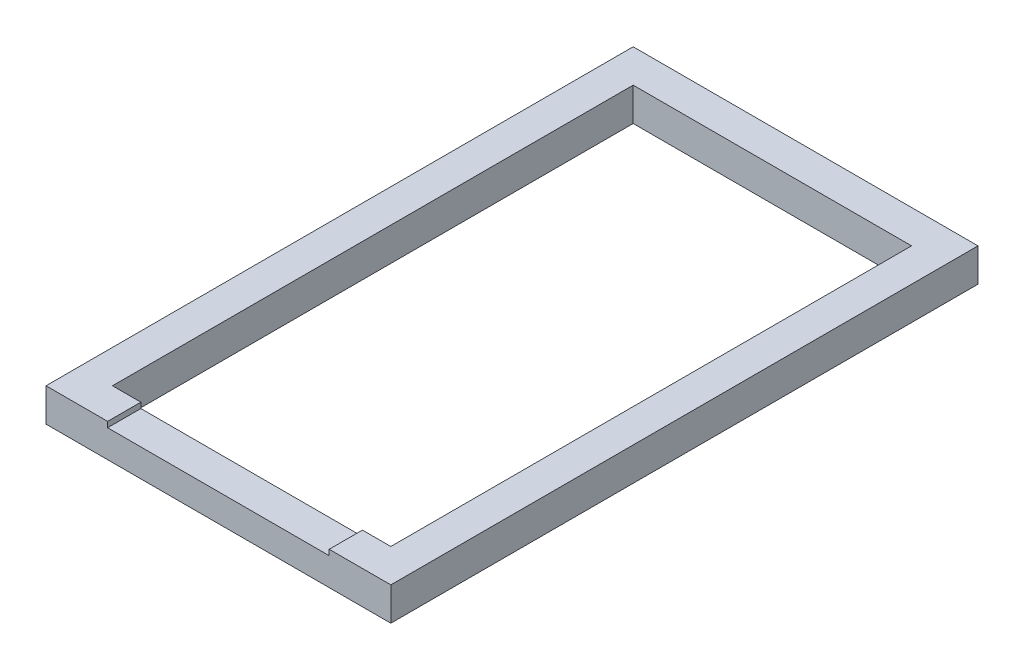
ISO-10303-21;
HEADER;
FILE_DESCRIPTION(('STEP AP214'),'2;1');
FILE_NAME('part.step','',(''),(''),'','','');
FILE_SCHEMA(('AUTOMOTIVE_DESIGN { 1 0 10303 214 1 1 1 1 }'));
ENDSEC;
DATA;
#1=APPLICATION_CONTEXT('core data for automotive mechanical design processes');
#2=APPLICATION_PROTOCOL_DEFINITION('international standard','automotive_design',2000,#1);
#3=PRODUCT_CONTEXT('',#1,'mechanical');
#4=PRODUCT('Part','Part','',(#3));
#5=PRODUCT_RELATED_PRODUCT_CATEGORY('part','',(#4));
#6=PRODUCT_DEFINITION_FORMATION('','',#4);
#7=PRODUCT_DEFINITION_CONTEXT('part definition',#1,'design');
#8=PRODUCT_DEFINITION('design','',#6,#7);
#9=PRODUCT_DEFINITION_SHAPE('','',#8);
#10=(LENGTH_UNIT() NAMED_UNIT(*) SI_UNIT(.MILLI.,.METRE.));
#11=(NAMED_UNIT(*) PLANE_ANGLE_UNIT() SI_UNIT($,.RADIAN.));
#12=(NAMED_UNIT(*) SI_UNIT($,.STERADIAN.) SOLID_ANGLE_UNIT());
#13=UNCERTAINTY_MEASURE_WITH_UNIT(LENGTH_MEASURE(1.E-05),#10,'distance_accuracy_value','');
#14=(GEOMETRIC_REPRESENTATION_CONTEXT(3) GLOBAL_UNCERTAINTY_ASSIGNED_CONTEXT((#13)) GLOBAL_UNIT_ASSIGNED_CONTEXT((#10,
#11,#12)) REPRESENTATION_CONTEXT('',''));
#15=CARTESIAN_POINT('',(0.,0.,0.));
#16=DIRECTION('',(0.,0.,1.));
#17=DIRECTION('',(1.,0.,0.));
#18=AXIS2_PLACEMENT_3D('',#15,#16,#17);
#19=CARTESIAN_POINT('',(-3112.49999999998,-600.,5300.));
#20=DIRECTION('',(0.,0.,1.));
#21=DIRECTION('',(1.,0.,0.));
#22=AXIS2_PLACEMENT_3D('',#19,#20,#21);
#23=PLANE('',#22);
#24=DIRECTION('',(1.,0.,0.));
#25=VECTOR('',#24,1.);
#26=CARTESIAN_POINT('',(-3112.49999999998,0.,5300.));
#27=LINE('',#26,#25);
#28=CARTESIAN_POINT('',(2000.,0.,5300.));
#29=VERTEX_POINT('',#28);
#30=CARTESIAN_POINT('',(3112.5,0.,5300.));
#31=VERTEX_POINT('',#30);
#32=EDGE_CURVE('E237',#29,#31,#27,.T.);
#33=ORIENTED_EDGE('',*,*,#32,.F.);
#34=DIRECTION('',(0.,-1.,0.));
#35=VECTOR('',#34,1.);
#36=CARTESIAN_POINT('',(2000.,-600.,5300.));
#37=LINE('',#36,#35);
#38=CARTESIAN_POINT('',(2000.,-99.9999999999999,5300.));
#39=VERTEX_POINT('',#38);
#40=EDGE_CURVE('E149',#29,#39,#37,.T.);
#41=ORIENTED_EDGE('',*,*,#40,.T.);
#42=DIRECTION('',(-1.,0.,0.));
#43=VECTOR('',#42,1.);
#44=CARTESIAN_POINT('',(-3112.49999999998,-99.9999999999999,5300.));
#45=LINE('',#44,#43);
#46=CARTESIAN_POINT('',(-2000.,-99.9999999999999,5300.));
#47=VERTEX_POINT('',#46);
#48=EDGE_CURVE('E131',#39,#47,#45,.T.);
#49=ORIENTED_EDGE('',*,*,#48,.T.);
#50=DIRECTION('',(0.,1.,0.));
#51=VECTOR('',#50,1.);
#52=CARTESIAN_POINT('',(-2000.,-600.,5300.));
#53=LINE('',#52,#51);
#54=CARTESIAN_POINT('',(-2000.,0.,5300.));
#55=VERTEX_POINT('',#54);
#56=EDGE_CURVE('E142',#47,#55,#53,.T.);
#57=ORIENTED_EDGE('',*,*,#56,.T.);
#58=CARTESIAN_POINT('',(-3112.49999999998,0.,5300.));
#59=VERTEX_POINT('',#58);
#60=EDGE_CURVE('E238',#59,#55,#27,.T.);
#61=ORIENTED_EDGE('',*,*,#60,.F.);
#62=DIRECTION('',(0.,1.,0.));
#63=VECTOR('',#62,1.);
#64=CARTESIAN_POINT('',(-3112.49999999998,-600.,5300.));
#65=LINE('',#64,#63);
#66=CARTESIAN_POINT('',(-3112.49999999998,-600.,5300.));
#67=VERTEX_POINT('',#66);
#68=EDGE_CURVE('E42',#67,#59,#65,.T.);
#69=ORIENTED_EDGE('',*,*,#68,.F.);
#70=DIRECTION('',(1.,0.,0.));
#71=VECTOR('',#70,1.);
#72=CARTESIAN_POINT('',(-3112.49999999998,-600.,5300.));
#73=LINE('',#72,#71);
#74=CARTESIAN_POINT('',(3112.5,-600.,5300.));
#75=VERTEX_POINT('',#74);
#76=EDGE_CURVE('E221',#67,#75,#73,.T.);
#77=ORIENTED_EDGE('',*,*,#76,.T.);
#78=DIRECTION('',(0.,1.,0.));
#79=VECTOR('',#78,1.);
#80=CARTESIAN_POINT('',(3112.5,-600.,5300.));
#81=LINE('',#80,#79);
#82=EDGE_CURVE('E249',#75,#31,#81,.T.);
#83=ORIENTED_EDGE('',*,*,#82,.T.);
#84=EDGE_LOOP('',(#33,#41,#49,#57,#61,#69,#77,#83));
#85=FACE_BOUND('',#84,.T.);
#86=ADVANCED_FACE('F38',(#85),#23,.T.);
#87=CARTESIAN_POINT('',(0.,0.,0.));
#88=DIRECTION('',(0.,1.,0.));
#89=DIRECTION('',(0.,0.,1.));
#90=AXIS2_PLACEMENT_3D('',#87,#88,#89);
#91=PLANE('',#90);
#92=DIRECTION('',(1.,0.,0.));
#93=VECTOR('',#92,1.);
#94=CARTESIAN_POINT('',(-2512.49999999998,0.,4700.));
#95=LINE('',#94,#93);
#96=CARTESIAN_POINT('',(2000.,0.,4700.));
#97=VERTEX_POINT('',#96);
#98=CARTESIAN_POINT('',(2512.5,0.,4700.));
#99=VERTEX_POINT('',#98);
#100=EDGE_CURVE('E195',#97,#99,#95,.T.);
#101=ORIENTED_EDGE('',*,*,#100,.F.);
#102=DIRECTION('',(0.,0.,1.));
#103=VECTOR('',#102,1.);
#104=CARTESIAN_POINT('',(2000.,0.,698.750195251481));
#105=LINE('',#104,#103);
#106=EDGE_CURVE('E162',#97,#29,#105,.T.);
#107=ORIENTED_EDGE('',*,*,#106,.T.);
#108=ORIENTED_EDGE('',*,*,#32,.T.);
#109=DIRECTION('',(0.,0.,-1.));
#110=VECTOR('',#109,1.);
#111=CARTESIAN_POINT('',(3112.5,0.,-5300.));
#112=LINE('',#111,#110);
#113=CARTESIAN_POINT('',(3112.5,0.,-5300.));
#114=VERTEX_POINT('',#113);
#115=EDGE_CURVE('E241',#31,#114,#112,.T.);
#116=ORIENTED_EDGE('',*,*,#115,.T.);
#117=DIRECTION('',(-1.,0.,0.));
#118=VECTOR('',#117,1.);
#119=CARTESIAN_POINT('',(-3112.49999999998,0.,-5300.));
#120=LINE('',#119,#118);
#121=CARTESIAN_POINT('',(-3112.49999999998,0.,-5300.));
#122=VERTEX_POINT('',#121);
#123=EDGE_CURVE('E222',#114,#122,#120,.T.);
#124=ORIENTED_EDGE('',*,*,#123,.T.);
#125=DIRECTION('',(0.,0.,1.));
#126=VECTOR('',#125,1.);
#127=CARTESIAN_POINT('',(-3112.49999999998,0.,-5300.));
#128=LINE('',#127,#126);
#129=EDGE_CURVE('E206',#122,#59,#128,.T.);
#130=ORIENTED_EDGE('',*,*,#129,.T.);
#131=ORIENTED_EDGE('',*,*,#60,.T.);
#132=DIRECTION('',(0.,0.,1.));
#133=VECTOR('',#132,1.);
#134=CARTESIAN_POINT('',(-2000.,0.,698.750195251482));
#135=LINE('',#134,#133);
#136=CARTESIAN_POINT('',(-2000.,0.,4700.));
#137=VERTEX_POINT('',#136);
#138=EDGE_CURVE('E139',#137,#55,#135,.T.);
#139=ORIENTED_EDGE('',*,*,#138,.F.);
#140=CARTESIAN_POINT('',(-2512.49999999998,0.,4700.));
#141=VERTEX_POINT('',#140);
#142=EDGE_CURVE('E196',#141,#137,#95,.T.);
#143=ORIENTED_EDGE('',*,*,#142,.F.);
#144=DIRECTION('',(0.,0.,1.));
#145=VECTOR('',#144,1.);
#146=CARTESIAN_POINT('',(-2512.49999999998,0.,-4700.));
#147=LINE('',#146,#145);
#148=CARTESIAN_POINT('',(-2512.49999999998,0.,-4700.));
#149=VERTEX_POINT('',#148);
#150=EDGE_CURVE('E191',#149,#141,#147,.T.);
#151=ORIENTED_EDGE('',*,*,#150,.F.);
#152=DIRECTION('',(-1.,0.,0.));
#153=VECTOR('',#152,1.);
#154=CARTESIAN_POINT('',(-2512.49999999998,0.,-4700.));
#155=LINE('',#154,#153);
#156=CARTESIAN_POINT('',(2512.5,0.,-4700.));
#157=VERTEX_POINT('',#156);
#158=EDGE_CURVE('E188',#157,#149,#155,.T.);
#159=ORIENTED_EDGE('',*,*,#158,.F.);
#160=DIRECTION('',(0.,0.,-1.));
#161=VECTOR('',#160,1.);
#162=CARTESIAN_POINT('',(2512.5,0.,-4700.));
#163=LINE('',#162,#161);
#164=EDGE_CURVE('E177',#99,#157,#163,.T.);
#165=ORIENTED_EDGE('',*,*,#164,.F.);
#166=EDGE_LOOP('',(#101,#107,#108,#116,#124,#130,#131,#139,#143,#151,#159,#165));
#167=FACE_BOUND('',#166,.T.);
#168=ADVANCED_FACE('F262',(#167),#91,.T.);
#169=CARTESIAN_POINT('',(-2512.49999999998,-600.,4700.));
#170=DIRECTION('',(0.,0.,1.));
#171=DIRECTION('',(1.,0.,0.));
#172=AXIS2_PLACEMENT_3D('',#169,#170,#171);
#173=PLANE('',#172);
#174=DIRECTION('',(0.,1.,0.));
#175=VECTOR('',#174,1.);
#176=CARTESIAN_POINT('',(2000.,-600.,4700.));
#177=LINE('',#176,#175);
#178=CARTESIAN_POINT('',(2000.,-99.9999999999999,4700.));
#179=VERTEX_POINT('',#178);
#180=EDGE_CURVE('E138',#179,#97,#177,.T.);
#181=ORIENTED_EDGE('',*,*,#180,.T.);
#182=ORIENTED_EDGE('',*,*,#100,.T.);
#183=DIRECTION('',(0.,1.,0.));
#184=VECTOR('',#183,1.);
#185=CARTESIAN_POINT('',(2512.5,-600.,4700.));
#186=LINE('',#185,#184);
#187=CARTESIAN_POINT('',(2512.5,-600.,4700.));
#188=VERTEX_POINT('',#187);
#189=EDGE_CURVE('E207',#188,#99,#186,.T.);
#190=ORIENTED_EDGE('',*,*,#189,.F.);
#191=DIRECTION('',(1.,0.,0.));
#192=VECTOR('',#191,1.);
#193=CARTESIAN_POINT('',(-2512.49999999998,-600.,4700.));
#194=LINE('',#193,#192);
#195=CARTESIAN_POINT('',(-2512.49999999998,-600.,4700.));
#196=VERTEX_POINT('',#195);
#197=EDGE_CURVE('E64',#196,#188,#194,.T.);
#198=ORIENTED_EDGE('',*,*,#197,.F.);
#199=DIRECTION('',(0.,1.,0.));
#200=VECTOR('',#199,1.);
#201=CARTESIAN_POINT('',(-2512.49999999998,-600.,4700.));
#202=LINE('',#201,#200);
#203=EDGE_CURVE('E211',#196,#141,#202,.T.);
#204=ORIENTED_EDGE('',*,*,#203,.T.);
#205=ORIENTED_EDGE('',*,*,#142,.T.);
#206=DIRECTION('',(0.,-1.,0.));
#207=VECTOR('',#206,1.);
#208=CARTESIAN_POINT('',(-2000.,-600.,4700.));
#209=LINE('',#208,#207);
#210=CARTESIAN_POINT('',(-2000.,-99.9999999999999,4700.));
#211=VERTEX_POINT('',#210);
#212=EDGE_CURVE('E171',#137,#211,#209,.T.);
#213=ORIENTED_EDGE('',*,*,#212,.T.);
#214=DIRECTION('',(1.,0.,0.));
#215=VECTOR('',#214,1.);
#216=CARTESIAN_POINT('',(-3112.49999999998,-99.9999999999999,4700.));
#217=LINE('',#216,#215);
#218=EDGE_CURVE('E134',#211,#179,#217,.T.);
#219=ORIENTED_EDGE('',*,*,#218,.T.);
#220=EDGE_LOOP('',(#181,#182,#190,#198,#204,#205,#213,#219));
#221=FACE_BOUND('',#220,.T.);
#222=ADVANCED_FACE('F286',(#221),#173,.F.);
#223=CARTESIAN_POINT('',(-3112.49999999998,-600.,-5300.));
#224=DIRECTION('',(-1.,0.,0.));
#225=DIRECTION('',(0.,0.,1.));
#226=AXIS2_PLACEMENT_3D('',#223,#224,#225);
#227=PLANE('',#226);
#228=ORIENTED_EDGE('',*,*,#129,.F.);
#229=DIRECTION('',(0.,1.,0.));
#230=VECTOR('',#229,1.);
#231=CARTESIAN_POINT('',(-3112.49999999998,-600.,-5300.));
#232=LINE('',#231,#230);
#233=CARTESIAN_POINT('',(-3112.49999999998,-600.,-5300.));
#234=VERTEX_POINT('',#233);
#235=EDGE_CURVE('E11',#234,#122,#232,.T.);
#236=ORIENTED_EDGE('',*,*,#235,.F.);
#237=DIRECTION('',(0.,0.,1.));
#238=VECTOR('',#237,1.);
#239=CARTESIAN_POINT('',(-3112.49999999998,-600.,-5300.));
#240=LINE('',#239,#238);
#241=EDGE_CURVE('E217',#234,#67,#240,.T.);
#242=ORIENTED_EDGE('',*,*,#241,.T.);
#243=ORIENTED_EDGE('',*,*,#68,.T.);
#244=EDGE_LOOP('',(#228,#236,#242,#243));
#245=FACE_BOUND('',#244,.T.);
#246=ADVANCED_FACE('F40',(#245),#227,.T.);
#247=CARTESIAN_POINT('',(-3112.49999999998,-600.,-5300.));
#248=DIRECTION('',(0.,0.,-1.));
#249=DIRECTION('',(-1.,0.,0.));
#250=AXIS2_PLACEMENT_3D('',#247,#248,#249);
#251=PLANE('',#250);
#252=ORIENTED_EDGE('',*,*,#123,.F.);
#253=DIRECTION('',(0.,1.,0.));
#254=VECTOR('',#253,1.);
#255=CARTESIAN_POINT('',(3112.5,-600.,-5300.));
#256=LINE('',#255,#254);
#257=CARTESIAN_POINT('',(3112.5,-600.,-5300.));
#258=VERTEX_POINT('',#257);
#259=EDGE_CURVE('E48',#258,#114,#256,.T.);
#260=ORIENTED_EDGE('',*,*,#259,.F.);
#261=DIRECTION('',(-1.,0.,0.));
#262=VECTOR('',#261,1.);
#263=CARTESIAN_POINT('',(-3112.49999999998,-600.,-5300.));
#264=LINE('',#263,#262);
#265=EDGE_CURVE('E230',#258,#234,#264,.T.);
#266=ORIENTED_EDGE('',*,*,#265,.T.);
#267=ORIENTED_EDGE('',*,*,#235,.T.);
#268=EDGE_LOOP('',(#252,#260,#266,#267));
#269=FACE_BOUND('',#268,.T.);
#270=ADVANCED_FACE('F265',(#269),#251,.T.);
#271=CARTESIAN_POINT('',(3112.5,-600.,-5300.));
#272=DIRECTION('',(1.,0.,0.));
#273=DIRECTION('',(0.,0.,-1.));
#274=AXIS2_PLACEMENT_3D('',#271,#272,#273);
#275=PLANE('',#274);
#276=ORIENTED_EDGE('',*,*,#115,.F.);
#277=ORIENTED_EDGE('',*,*,#82,.F.);
#278=DIRECTION('',(0.,0.,-1.));
#279=VECTOR('',#278,1.);
#280=CARTESIAN_POINT('',(3112.5,-600.,-5300.));
#281=LINE('',#280,#279);
#282=EDGE_CURVE('E226',#75,#258,#281,.T.);
#283=ORIENTED_EDGE('',*,*,#282,.T.);
#284=ORIENTED_EDGE('',*,*,#259,.T.);
#285=EDGE_LOOP('',(#276,#277,#283,#284));
#286=FACE_BOUND('',#285,.T.);
#287=ADVANCED_FACE('F271',(#286),#275,.T.);
#288=CARTESIAN_POINT('',(0.,-600.,0.));
#289=DIRECTION('',(0.,1.,0.));
#290=DIRECTION('',(0.,0.,1.));
#291=AXIS2_PLACEMENT_3D('',#288,#289,#290);
#292=PLANE('',#291);
#293=DIRECTION('',(0.,0.,-1.));
#294=VECTOR('',#293,1.);
#295=CARTESIAN_POINT('',(2512.5,-600.,-4700.));
#296=LINE('',#295,#294);
#297=CARTESIAN_POINT('',(2512.5,-600.,-4700.));
#298=VERTEX_POINT('',#297);
#299=EDGE_CURVE('E183',#188,#298,#296,.T.);
#300=ORIENTED_EDGE('',*,*,#299,.T.);
#301=DIRECTION('',(-1.,0.,0.));
#302=VECTOR('',#301,1.);
#303=CARTESIAN_POINT('',(-2512.49999999998,-600.,-4700.));
#304=LINE('',#303,#302);
#305=CARTESIAN_POINT('',(-2512.49999999998,-600.,-4700.));
#306=VERTEX_POINT('',#305);
#307=EDGE_CURVE('E172',#298,#306,#304,.T.);
#308=ORIENTED_EDGE('',*,*,#307,.T.);
#309=DIRECTION('',(0.,0.,1.));
#310=VECTOR('',#309,1.);
#311=CARTESIAN_POINT('',(-2512.49999999998,-600.,-4700.));
#312=LINE('',#311,#310);
#313=EDGE_CURVE('E176',#306,#196,#312,.T.);
#314=ORIENTED_EDGE('',*,*,#313,.T.);
#315=ORIENTED_EDGE('',*,*,#197,.T.);
#316=EDGE_LOOP('',(#300,#308,#314,#315));
#317=FACE_BOUND('',#316,.T.);
#318=ORIENTED_EDGE('',*,*,#241,.F.);
#319=ORIENTED_EDGE('',*,*,#265,.F.);
#320=ORIENTED_EDGE('',*,*,#282,.F.);
#321=ORIENTED_EDGE('',*,*,#76,.F.);
#322=EDGE_LOOP('',(#318,#319,#320,#321));
#323=FACE_BOUND('',#322,.T.);
#324=ADVANCED_FACE('F268',(#317,#323),#292,.F.);
#325=CARTESIAN_POINT('',(-2512.49999999998,-600.,-4700.));
#326=DIRECTION('',(0.,0.,-1.));
#327=DIRECTION('',(-1.,0.,0.));
#328=AXIS2_PLACEMENT_3D('',#325,#326,#327);
#329=PLANE('',#328);
#330=ORIENTED_EDGE('',*,*,#158,.T.);
#331=DIRECTION('',(0.,1.,0.));
#332=VECTOR('',#331,1.);
#333=CARTESIAN_POINT('',(-2512.49999999998,-600.,-4700.));
#334=LINE('',#333,#332);
#335=EDGE_CURVE('E187',#306,#149,#334,.T.);
#336=ORIENTED_EDGE('',*,*,#335,.F.);
#337=ORIENTED_EDGE('',*,*,#307,.F.);
#338=DIRECTION('',(0.,1.,0.));
#339=VECTOR('',#338,1.);
#340=CARTESIAN_POINT('',(2512.5,-600.,-4700.));
#341=LINE('',#340,#339);
#342=EDGE_CURVE('E203',#298,#157,#341,.T.);
#343=ORIENTED_EDGE('',*,*,#342,.T.);
#344=EDGE_LOOP('',(#330,#336,#337,#343));
#345=FACE_BOUND('',#344,.T.);
#346=ADVANCED_FACE('F278',(#345),#329,.F.);
#347=CARTESIAN_POINT('',(2512.5,-600.,-4700.));
#348=DIRECTION('',(1.,0.,0.));
#349=DIRECTION('',(0.,0.,-1.));
#350=AXIS2_PLACEMENT_3D('',#347,#348,#349);
#351=PLANE('',#350);
#352=ORIENTED_EDGE('',*,*,#164,.T.);
#353=ORIENTED_EDGE('',*,*,#342,.F.);
#354=ORIENTED_EDGE('',*,*,#299,.F.);
#355=ORIENTED_EDGE('',*,*,#189,.T.);
#356=EDGE_LOOP('',(#352,#353,#354,#355));
#357=FACE_BOUND('',#356,.T.);
#358=ADVANCED_FACE('F295',(#357),#351,.F.);
#359=CARTESIAN_POINT('',(-2512.49999999998,-600.,-4700.));
#360=DIRECTION('',(-1.,0.,0.));
#361=DIRECTION('',(0.,0.,1.));
#362=AXIS2_PLACEMENT_3D('',#359,#360,#361);
#363=PLANE('',#362);
#364=ORIENTED_EDGE('',*,*,#150,.T.);
#365=ORIENTED_EDGE('',*,*,#203,.F.);
#366=ORIENTED_EDGE('',*,*,#313,.F.);
#367=ORIENTED_EDGE('',*,*,#335,.T.);
#368=EDGE_LOOP('',(#364,#365,#366,#367));
#369=FACE_BOUND('',#368,.T.);
#370=ADVANCED_FACE('F297',(#369),#363,.F.);
#371=CARTESIAN_POINT('',(2000.,-600.,698.750195251481));
#372=DIRECTION('',(-1.,0.,0.));
#373=DIRECTION('',(0.,0.,1.));
#374=AXIS2_PLACEMENT_3D('',#371,#372,#373);
#375=PLANE('',#374);
#376=DIRECTION('',(0.,0.,1.));
#377=VECTOR('',#376,1.);
#378=CARTESIAN_POINT('',(2000.,-99.9999999999999,698.750195251481));
#379=LINE('',#378,#377);
#380=EDGE_CURVE('E56',#179,#39,#379,.T.);
#381=ORIENTED_EDGE('',*,*,#380,.T.);
#382=ORIENTED_EDGE('',*,*,#40,.F.);
#383=ORIENTED_EDGE('',*,*,#106,.F.);
#384=ORIENTED_EDGE('',*,*,#180,.F.);
#385=EDGE_LOOP('',(#381,#382,#383,#384));
#386=FACE_BOUND('',#385,.T.);
#387=ADVANCED_FACE('F299',(#386),#375,.T.);
#388=CARTESIAN_POINT('',(-2000.,-600.,698.750195251482));
#389=DIRECTION('',(1.,0.,0.));
#390=DIRECTION('',(0.,0.,-1.));
#391=AXIS2_PLACEMENT_3D('',#388,#389,#390);
#392=PLANE('',#391);
#393=ORIENTED_EDGE('',*,*,#138,.T.);
#394=ORIENTED_EDGE('',*,*,#56,.F.);
#395=DIRECTION('',(0.,0.,1.));
#396=VECTOR('',#395,1.);
#397=CARTESIAN_POINT('',(-2000.,-99.9999999999999,698.750195251482));
#398=LINE('',#397,#396);
#399=EDGE_CURVE('E127',#211,#47,#398,.T.);
#400=ORIENTED_EDGE('',*,*,#399,.F.);
#401=ORIENTED_EDGE('',*,*,#212,.F.);
#402=EDGE_LOOP('',(#393,#394,#400,#401));
#403=FACE_BOUND('',#402,.T.);
#404=ADVANCED_FACE('F143',(#403),#392,.T.);
#405=CARTESIAN_POINT('',(-3112.49999999998,-99.9999999999999,698.750195251482));
#406=DIRECTION('',(0.,1.,0.));
#407=DIRECTION('',(0.,0.,1.));
#408=AXIS2_PLACEMENT_3D('',#405,#406,#407);
#409=PLANE('',#408);
#410=ORIENTED_EDGE('',*,*,#399,.T.);
#411=ORIENTED_EDGE('',*,*,#48,.F.);
#412=ORIENTED_EDGE('',*,*,#380,.F.);
#413=ORIENTED_EDGE('',*,*,#218,.F.);
#414=EDGE_LOOP('',(#410,#411,#412,#413));
#415=FACE_BOUND('',#414,.T.);
#416=ADVANCED_FACE('F129',(#415),#409,.T.);
#417=CLOSED_SHELL('',(#86,#168,#222,#246,#270,#287,#324,#346,#358,#370,#387,#404,#416));
#418=MANIFOLD_SOLID_BREP('B2',#417);
#419=ADVANCED_BREP_SHAPE_REPRESENTATION('',(#18,#418),#14);
#420=SHAPE_DEFINITION_REPRESENTATION(#9,#419);
ENDSEC;
END-ISO-10303-21;
